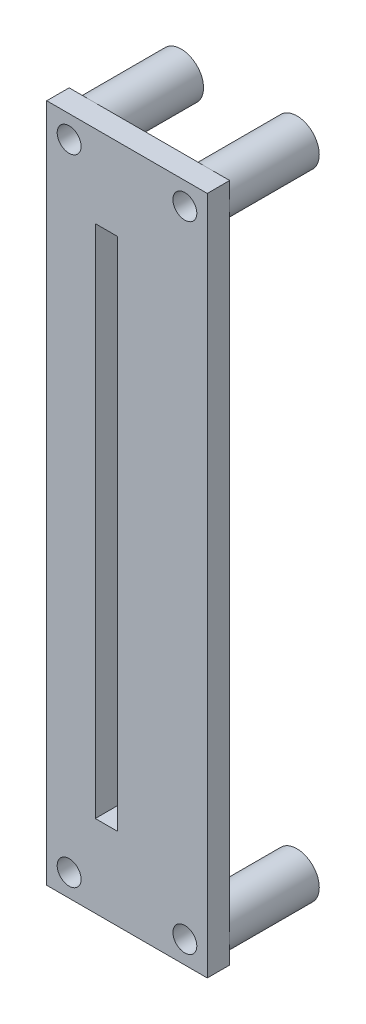
ISO-10303-21;
HEADER;
FILE_DESCRIPTION(('STEP AP214'),'2;1');
FILE_NAME('part.step','',(''),(''),'','','');
FILE_SCHEMA(('AUTOMOTIVE_DESIGN { 1 0 10303 214 1 1 1 1 }'));
ENDSEC;
DATA;
#1=APPLICATION_CONTEXT('core data for automotive mechanical design processes');
#2=APPLICATION_PROTOCOL_DEFINITION('international standard','automotive_design',2000,#1);
#3=PRODUCT_CONTEXT('',#1,'mechanical');
#4=PRODUCT('Part','Part','',(#3));
#5=PRODUCT_RELATED_PRODUCT_CATEGORY('part','',(#4));
#6=PRODUCT_DEFINITION_FORMATION('','',#4);
#7=PRODUCT_DEFINITION_CONTEXT('part definition',#1,'design');
#8=PRODUCT_DEFINITION('design','',#6,#7);
#9=PRODUCT_DEFINITION_SHAPE('','',#8);
#10=(LENGTH_UNIT() NAMED_UNIT(*) SI_UNIT(.MILLI.,.METRE.));
#11=(NAMED_UNIT(*) PLANE_ANGLE_UNIT() SI_UNIT($,.RADIAN.));
#12=(NAMED_UNIT(*) SI_UNIT($,.STERADIAN.) SOLID_ANGLE_UNIT());
#13=UNCERTAINTY_MEASURE_WITH_UNIT(LENGTH_MEASURE(1.E-05),#10,'distance_accuracy_value','');
#14=(GEOMETRIC_REPRESENTATION_CONTEXT(3) GLOBAL_UNCERTAINTY_ASSIGNED_CONTEXT((#13)) GLOBAL_UNIT_ASSIGNED_CONTEXT((#10,
#11,#12)) REPRESENTATION_CONTEXT('',''));
#15=CARTESIAN_POINT('',(0.,0.,0.));
#16=DIRECTION('',(0.,0.,1.));
#17=DIRECTION('',(1.,0.,0.));
#18=AXIS2_PLACEMENT_3D('',#15,#16,#17);
#19=CARTESIAN_POINT('',(0.,0.,0.));
#20=DIRECTION('',(0.,0.,-1.));
#21=DIRECTION('',(-1.,0.,0.));
#22=AXIS2_PLACEMENT_3D('',#19,#20,#21);
#23=PLANE('',#22);
#24=CARTESIAN_POINT('',(3.,88.,0.));
#25=DIRECTION('',(0.,0.,1.));
#26=DIRECTION('',(1.,0.,0.));
#27=AXIS2_PLACEMENT_3D('',#24,#25,#26);
#28=CIRCLE('',#27,2.99999999999997);
#29=CARTESIAN_POINT('',(3.,91.,0.));
#30=VERTEX_POINT('',#29);
#31=CARTESIAN_POINT('',(0.,88.,0.));
#32=VERTEX_POINT('',#31);
#33=EDGE_CURVE('E151',#30,#32,#28,.T.);
#34=ORIENTED_EDGE('',*,*,#33,.T.);
#35=DIRECTION('',(0.,-1.,0.));
#36=VECTOR('',#35,1.);
#37=CARTESIAN_POINT('',(0.,0.,0.));
#38=LINE('',#37,#36);
#39=CARTESIAN_POINT('',(0.,91.,0.));
#40=VERTEX_POINT('',#39);
#41=EDGE_CURVE('E133',#40,#32,#38,.T.);
#42=ORIENTED_EDGE('',*,*,#41,.F.);
#43=DIRECTION('',(-1.,0.,0.));
#44=VECTOR('',#43,1.);
#45=CARTESIAN_POINT('',(0.,91.,0.));
#46=LINE('',#45,#44);
#47=EDGE_CURVE('E152',#30,#40,#46,.T.);
#48=ORIENTED_EDGE('',*,*,#47,.F.);
#49=EDGE_LOOP('',(#34,#42,#48));
#50=FACE_BOUND('',#49,.T.);
#51=ADVANCED_FACE('F39',(#50),#23,.T.);
#52=CARTESIAN_POINT('',(18.5,88.,0.));
#53=DIRECTION('',(0.,0.,1.));
#54=DIRECTION('',(1.,0.,0.));
#55=AXIS2_PLACEMENT_3D('',#52,#53,#54);
#56=CIRCLE('',#55,2.99999999999997);
#57=CARTESIAN_POINT('',(21.5,88.,0.));
#58=VERTEX_POINT('',#57);
#59=CARTESIAN_POINT('',(18.5,91.,0.));
#60=VERTEX_POINT('',#59);
#61=EDGE_CURVE('E175',#58,#60,#56,.T.);
#62=ORIENTED_EDGE('',*,*,#61,.T.);
#63=CARTESIAN_POINT('',(21.5,91.,0.));
#64=VERTEX_POINT('',#63);
#65=EDGE_CURVE('E264',#64,#60,#46,.T.);
#66=ORIENTED_EDGE('',*,*,#65,.F.);
#67=DIRECTION('',(0.,1.,0.));
#68=VECTOR('',#67,1.);
#69=CARTESIAN_POINT('',(21.5,0.,0.));
#70=LINE('',#69,#68);
#71=EDGE_CURVE('E277',#58,#64,#70,.T.);
#72=ORIENTED_EDGE('',*,*,#71,.F.);
#73=EDGE_LOOP('',(#62,#66,#72));
#74=FACE_BOUND('',#73,.T.);
#75=ADVANCED_FACE('F328',(#74),#23,.T.);
#76=CARTESIAN_POINT('',(18.5,3.,0.));
#77=DIRECTION('',(0.,0.,1.));
#78=DIRECTION('',(1.,0.,0.));
#79=AXIS2_PLACEMENT_3D('',#76,#77,#78);
#80=CIRCLE('',#79,3.);
#81=CARTESIAN_POINT('',(18.5,0.,0.));
#82=VERTEX_POINT('',#81);
#83=CARTESIAN_POINT('',(21.5,3.,0.));
#84=VERTEX_POINT('',#83);
#85=EDGE_CURVE('E182',#82,#84,#80,.T.);
#86=ORIENTED_EDGE('',*,*,#85,.T.);
#87=CARTESIAN_POINT('',(21.5,0.,0.));
#88=VERTEX_POINT('',#87);
#89=EDGE_CURVE('E279',#88,#84,#70,.T.);
#90=ORIENTED_EDGE('',*,*,#89,.F.);
#91=DIRECTION('',(1.,0.,0.));
#92=VECTOR('',#91,1.);
#93=CARTESIAN_POINT('',(0.,0.,0.));
#94=LINE('',#93,#92);
#95=EDGE_CURVE('E142',#82,#88,#94,.T.);
#96=ORIENTED_EDGE('',*,*,#95,.F.);
#97=EDGE_LOOP('',(#86,#90,#96));
#98=FACE_BOUND('',#97,.T.);
#99=ADVANCED_FACE('F316',(#98),#23,.T.);
#100=CARTESIAN_POINT('',(0.,3.,0.));
#101=VERTEX_POINT('',#100);
#102=CARTESIAN_POINT('',(0.,0.,0.));
#103=VERTEX_POINT('',#102);
#104=EDGE_CURVE('E144',#101,#103,#38,.T.);
#105=ORIENTED_EDGE('',*,*,#104,.F.);
#106=CARTESIAN_POINT('',(3.00000000000001,3.,0.));
#107=DIRECTION('',(0.,0.,1.));
#108=DIRECTION('',(1.,0.,0.));
#109=AXIS2_PLACEMENT_3D('',#106,#107,#108);
#110=CIRCLE('',#109,3.);
#111=CARTESIAN_POINT('',(3.00000000000001,0.,0.));
#112=VERTEX_POINT('',#111);
#113=EDGE_CURVE('E50',#101,#112,#110,.T.);
#114=ORIENTED_EDGE('',*,*,#113,.T.);
#115=EDGE_CURVE('E273',#103,#112,#94,.T.);
#116=ORIENTED_EDGE('',*,*,#115,.F.);
#117=EDGE_LOOP('',(#105,#114,#116));
#118=FACE_BOUND('',#117,.T.);
#119=ADVANCED_FACE('F307',(#118),#23,.T.);
#120=CARTESIAN_POINT('',(0.,0.,3.));
#121=DIRECTION('',(0.,0.,-1.));
#122=DIRECTION('',(-1.,0.,0.));
#123=AXIS2_PLACEMENT_3D('',#120,#121,#122);
#124=PLANE('',#123);
#125=CARTESIAN_POINT('',(18.5,3.,3.));
#126=DIRECTION('',(0.,0.,1.));
#127=DIRECTION('',(1.,0.,0.));
#128=AXIS2_PLACEMENT_3D('',#125,#126,#127);
#129=CIRCLE('',#128,1.6);
#130=CARTESIAN_POINT('',(20.1,3.,3.));
#131=VERTEX_POINT('',#130);
#132=EDGE_CURVE('E243',#131,#131,#129,.T.);
#133=ORIENTED_EDGE('',*,*,#132,.F.);
#134=EDGE_LOOP('',(#133));
#135=FACE_BOUND('',#134,.T.);
#136=CARTESIAN_POINT('',(3.00000000000001,3.,3.));
#137=DIRECTION('',(0.,0.,1.));
#138=DIRECTION('',(1.,0.,0.));
#139=AXIS2_PLACEMENT_3D('',#136,#137,#138);
#140=CIRCLE('',#139,1.6);
#141=CARTESIAN_POINT('',(4.60000000000001,3.,3.));
#142=VERTEX_POINT('',#141);
#143=EDGE_CURVE('E247',#142,#142,#140,.T.);
#144=ORIENTED_EDGE('',*,*,#143,.F.);
#145=EDGE_LOOP('',(#144));
#146=FACE_BOUND('',#145,.T.);
#147=CARTESIAN_POINT('',(18.5,88.,3.));
#148=DIRECTION('',(0.,0.,1.));
#149=DIRECTION('',(1.,0.,0.));
#150=AXIS2_PLACEMENT_3D('',#147,#148,#149);
#151=CIRCLE('',#150,1.60000000000001);
#152=CARTESIAN_POINT('',(20.1,88.,3.));
#153=VERTEX_POINT('',#152);
#154=EDGE_CURVE('E251',#153,#153,#151,.T.);
#155=ORIENTED_EDGE('',*,*,#154,.F.);
#156=EDGE_LOOP('',(#155));
#157=FACE_BOUND('',#156,.T.);
#158=CARTESIAN_POINT('',(3.,88.,3.));
#159=DIRECTION('',(0.,0.,1.));
#160=DIRECTION('',(1.,0.,0.));
#161=AXIS2_PLACEMENT_3D('',#158,#159,#160);
#162=CIRCLE('',#161,1.6);
#163=CARTESIAN_POINT('',(4.6,88.,3.));
#164=VERTEX_POINT('',#163);
#165=EDGE_CURVE('E255',#164,#164,#162,.T.);
#166=ORIENTED_EDGE('',*,*,#165,.F.);
#167=EDGE_LOOP('',(#166));
#168=FACE_BOUND('',#167,.T.);
#169=DIRECTION('',(0.,-1.,0.));
#170=VECTOR('',#169,1.);
#171=CARTESIAN_POINT('',(0.,0.,3.));
#172=LINE('',#171,#170);
#173=CARTESIAN_POINT('',(0.,91.,3.));
#174=VERTEX_POINT('',#173);
#175=CARTESIAN_POINT('',(0.,0.,3.));
#176=VERTEX_POINT('',#175);
#177=EDGE_CURVE('E259',#174,#176,#172,.T.);
#178=ORIENTED_EDGE('',*,*,#177,.T.);
#179=DIRECTION('',(1.,0.,0.));
#180=VECTOR('',#179,1.);
#181=CARTESIAN_POINT('',(0.,0.,3.));
#182=LINE('',#181,#180);
#183=CARTESIAN_POINT('',(21.5,0.,3.));
#184=VERTEX_POINT('',#183);
#185=EDGE_CURVE('E263',#176,#184,#182,.T.);
#186=ORIENTED_EDGE('',*,*,#185,.T.);
#187=DIRECTION('',(0.,1.,0.));
#188=VECTOR('',#187,1.);
#189=CARTESIAN_POINT('',(21.5,0.,3.));
#190=LINE('',#189,#188);
#191=CARTESIAN_POINT('',(21.5,91.,3.));
#192=VERTEX_POINT('',#191);
#193=EDGE_CURVE('E267',#184,#192,#190,.T.);
#194=ORIENTED_EDGE('',*,*,#193,.T.);
#195=DIRECTION('',(-1.,0.,0.));
#196=VECTOR('',#195,1.);
#197=CARTESIAN_POINT('',(0.,91.,3.));
#198=LINE('',#197,#196);
#199=EDGE_CURVE('E270',#192,#174,#198,.T.);
#200=ORIENTED_EDGE('',*,*,#199,.T.);
#201=EDGE_LOOP('',(#178,#186,#194,#200));
#202=FACE_BOUND('',#201,.T.);
#203=DIRECTION('',(0.,-1.,0.));
#204=VECTOR('',#203,1.);
#205=CARTESIAN_POINT('',(6.50000000000001,80.,3.));
#206=LINE('',#205,#204);
#207=CARTESIAN_POINT('',(6.50000000000001,80.,3.));
#208=VERTEX_POINT('',#207);
#209=CARTESIAN_POINT('',(6.50000000000002,11.,3.));
#210=VERTEX_POINT('',#209);
#211=EDGE_CURVE('E201',#208,#210,#206,.T.);
#212=ORIENTED_EDGE('',*,*,#211,.F.);
#213=DIRECTION('',(-1.,0.,0.));
#214=VECTOR('',#213,1.);
#215=CARTESIAN_POINT('',(6.50000000000001,80.,3.));
#216=LINE('',#215,#214);
#217=CARTESIAN_POINT('',(9.50000000000001,80.,3.));
#218=VERTEX_POINT('',#217);
#219=EDGE_CURVE('E212',#218,#208,#216,.T.);
#220=ORIENTED_EDGE('',*,*,#219,.F.);
#221=DIRECTION('',(0.,1.,0.));
#222=VECTOR('',#221,1.);
#223=CARTESIAN_POINT('',(9.50000000000001,80.,3.));
#224=LINE('',#223,#222);
#225=CARTESIAN_POINT('',(9.50000000000002,11.,3.));
#226=VERTEX_POINT('',#225);
#227=EDGE_CURVE('E208',#226,#218,#224,.T.);
#228=ORIENTED_EDGE('',*,*,#227,.F.);
#229=DIRECTION('',(1.,0.,0.));
#230=VECTOR('',#229,1.);
#231=CARTESIAN_POINT('',(6.50000000000002,11.,3.));
#232=LINE('',#231,#230);
#233=EDGE_CURVE('E204',#210,#226,#232,.T.);
#234=ORIENTED_EDGE('',*,*,#233,.F.);
#235=EDGE_LOOP('',(#212,#220,#228,#234));
#236=FACE_BOUND('',#235,.T.);
#237=ADVANCED_FACE('F354',(#135,#146,#157,#168,#202,#236),#124,.F.);
#238=EDGE_CURVE('E57',#32,#30,#28,.T.);
#239=ORIENTED_EDGE('',*,*,#238,.T.);
#240=EDGE_CURVE('E285',#60,#30,#46,.T.);
#241=ORIENTED_EDGE('',*,*,#240,.F.);
#242=EDGE_CURVE('E63',#60,#58,#56,.T.);
#243=ORIENTED_EDGE('',*,*,#242,.T.);
#244=EDGE_CURVE('E282',#84,#58,#70,.T.);
#245=ORIENTED_EDGE('',*,*,#244,.F.);
#246=EDGE_CURVE('E188',#84,#82,#80,.T.);
#247=ORIENTED_EDGE('',*,*,#246,.T.);
#248=EDGE_CURVE('E278',#112,#82,#94,.T.);
#249=ORIENTED_EDGE('',*,*,#248,.F.);
#250=EDGE_CURVE('E11',#112,#101,#110,.T.);
#251=ORIENTED_EDGE('',*,*,#250,.T.);
#252=EDGE_CURVE('E134',#32,#101,#38,.T.);
#253=ORIENTED_EDGE('',*,*,#252,.F.);
#254=EDGE_LOOP('',(#239,#241,#243,#245,#247,#249,#251,#253));
#255=FACE_BOUND('',#254,.T.);
#256=DIRECTION('',(-1.,0.,0.));
#257=VECTOR('',#256,1.);
#258=CARTESIAN_POINT('',(6.50000000000001,80.,0.));
#259=LINE('',#258,#257);
#260=CARTESIAN_POINT('',(9.50000000000001,80.,0.));
#261=VERTEX_POINT('',#260);
#262=CARTESIAN_POINT('',(6.50000000000001,80.,0.));
#263=VERTEX_POINT('',#262);
#264=EDGE_CURVE('E205',#261,#263,#259,.T.);
#265=ORIENTED_EDGE('',*,*,#264,.T.);
#266=DIRECTION('',(0.,-1.,0.));
#267=VECTOR('',#266,1.);
#268=CARTESIAN_POINT('',(6.50000000000001,80.,0.));
#269=LINE('',#268,#267);
#270=CARTESIAN_POINT('',(6.50000000000002,11.,0.));
#271=VERTEX_POINT('',#270);
#272=EDGE_CURVE('E197',#263,#271,#269,.T.);
#273=ORIENTED_EDGE('',*,*,#272,.T.);
#274=DIRECTION('',(1.,0.,0.));
#275=VECTOR('',#274,1.);
#276=CARTESIAN_POINT('',(6.50000000000002,11.,0.));
#277=LINE('',#276,#275);
#278=CARTESIAN_POINT('',(9.50000000000002,11.,0.));
#279=VERTEX_POINT('',#278);
#280=EDGE_CURVE('E219',#271,#279,#277,.T.);
#281=ORIENTED_EDGE('',*,*,#280,.T.);
#282=DIRECTION('',(0.,1.,0.));
#283=VECTOR('',#282,1.);
#284=CARTESIAN_POINT('',(9.50000000000001,80.,0.));
#285=LINE('',#284,#283);
#286=EDGE_CURVE('E223',#279,#261,#285,.T.);
#287=ORIENTED_EDGE('',*,*,#286,.T.);
#288=EDGE_LOOP('',(#265,#273,#281,#287));
#289=FACE_BOUND('',#288,.T.);
#290=ADVANCED_FACE('F145',(#255,#289),#23,.T.);
#291=CARTESIAN_POINT('',(0.,0.,3.));
#292=DIRECTION('',(1.,0.,0.));
#293=DIRECTION('',(0.,1.,0.));
#294=AXIS2_PLACEMENT_3D('',#291,#292,#293);
#295=PLANE('',#294);
#296=ORIENTED_EDGE('',*,*,#41,.T.);
#297=ORIENTED_EDGE('',*,*,#252,.T.);
#298=ORIENTED_EDGE('',*,*,#104,.T.);
#299=DIRECTION('',(0.,0.,-1.));
#300=VECTOR('',#299,1.);
#301=CARTESIAN_POINT('',(0.,0.,3.));
#302=LINE('',#301,#300);
#303=EDGE_CURVE('E43',#176,#103,#302,.T.);
#304=ORIENTED_EDGE('',*,*,#303,.F.);
#305=ORIENTED_EDGE('',*,*,#177,.F.);
#306=DIRECTION('',(0.,0.,-1.));
#307=VECTOR('',#306,1.);
#308=CARTESIAN_POINT('',(0.,91.,3.));
#309=LINE('',#308,#307);
#310=EDGE_CURVE('E138',#174,#40,#309,.T.);
#311=ORIENTED_EDGE('',*,*,#310,.T.);
#312=EDGE_LOOP('',(#296,#297,#298,#304,#305,#311));
#313=FACE_BOUND('',#312,.T.);
#314=ADVANCED_FACE('F41',(#313),#295,.F.);
#315=CARTESIAN_POINT('',(0.,0.,3.));
#316=DIRECTION('',(0.,1.,0.));
#317=DIRECTION('',(-1.,0.,0.));
#318=AXIS2_PLACEMENT_3D('',#315,#316,#317);
#319=PLANE('',#318);
#320=ORIENTED_EDGE('',*,*,#115,.T.);
#321=ORIENTED_EDGE('',*,*,#248,.T.);
#322=ORIENTED_EDGE('',*,*,#95,.T.);
#323=DIRECTION('',(0.,0.,-1.));
#324=VECTOR('',#323,1.);
#325=CARTESIAN_POINT('',(21.5,0.,3.));
#326=LINE('',#325,#324);
#327=EDGE_CURVE('E291',#184,#88,#326,.T.);
#328=ORIENTED_EDGE('',*,*,#327,.F.);
#329=ORIENTED_EDGE('',*,*,#185,.F.);
#330=ORIENTED_EDGE('',*,*,#303,.T.);
#331=EDGE_LOOP('',(#320,#321,#322,#328,#329,#330));
#332=FACE_BOUND('',#331,.T.);
#333=ADVANCED_FACE('F302',(#332),#319,.F.);
#334=CARTESIAN_POINT('',(21.5,0.,3.));
#335=DIRECTION('',(-1.,0.,0.));
#336=DIRECTION('',(0.,-1.,0.));
#337=AXIS2_PLACEMENT_3D('',#334,#335,#336);
#338=PLANE('',#337);
#339=ORIENTED_EDGE('',*,*,#89,.T.);
#340=ORIENTED_EDGE('',*,*,#244,.T.);
#341=ORIENTED_EDGE('',*,*,#71,.T.);
#342=DIRECTION('',(0.,0.,-1.));
#343=VECTOR('',#342,1.);
#344=CARTESIAN_POINT('',(21.5,91.,3.));
#345=LINE('',#344,#343);
#346=EDGE_CURVE('E288',#192,#64,#345,.T.);
#347=ORIENTED_EDGE('',*,*,#346,.F.);
#348=ORIENTED_EDGE('',*,*,#193,.F.);
#349=ORIENTED_EDGE('',*,*,#327,.T.);
#350=EDGE_LOOP('',(#339,#340,#341,#347,#348,#349));
#351=FACE_BOUND('',#350,.T.);
#352=ADVANCED_FACE('F318',(#351),#338,.F.);
#353=CARTESIAN_POINT('',(0.,91.,3.));
#354=DIRECTION('',(0.,-1.,0.));
#355=DIRECTION('',(0.,0.,-1.));
#356=AXIS2_PLACEMENT_3D('',#353,#354,#355);
#357=PLANE('',#356);
#358=ORIENTED_EDGE('',*,*,#65,.T.);
#359=ORIENTED_EDGE('',*,*,#240,.T.);
#360=ORIENTED_EDGE('',*,*,#47,.T.);
#361=ORIENTED_EDGE('',*,*,#310,.F.);
#362=ORIENTED_EDGE('',*,*,#199,.F.);
#363=ORIENTED_EDGE('',*,*,#346,.T.);
#364=EDGE_LOOP('',(#358,#359,#360,#361,#362,#363));
#365=FACE_BOUND('',#364,.T.);
#366=ADVANCED_FACE('F327',(#365),#357,.F.);
#367=CARTESIAN_POINT('',(3.,88.,3.));
#368=DIRECTION('',(0.,0.,-1.));
#369=DIRECTION('',(-1.,0.,0.));
#370=AXIS2_PLACEMENT_3D('',#367,#368,#369);
#371=CYLINDRICAL_SURFACE('',#370,1.6);
#372=ORIENTED_EDGE('',*,*,#165,.T.);
#373=EDGE_LOOP('',(#372));
#374=FACE_BOUND('',#373,.T.);
#375=CARTESIAN_POINT('',(3.,88.,-12.));
#376=DIRECTION('',(0.,0.,1.));
#377=DIRECTION('',(1.,0.,0.));
#378=AXIS2_PLACEMENT_3D('',#375,#376,#377);
#379=CIRCLE('',#378,1.60000000000001);
#380=CARTESIAN_POINT('',(4.60000000000001,88.,-12.));
#381=VERTEX_POINT('',#380);
#382=EDGE_CURVE('E160',#381,#381,#379,.T.);
#383=ORIENTED_EDGE('',*,*,#382,.F.);
#384=EDGE_LOOP('',(#383));
#385=FACE_BOUND('',#384,.T.);
#386=ADVANCED_FACE('F459',(#374,#385),#371,.F.);
#387=CARTESIAN_POINT('',(18.5,88.,3.));
#388=DIRECTION('',(0.,0.,-1.));
#389=DIRECTION('',(-1.,0.,0.));
#390=AXIS2_PLACEMENT_3D('',#387,#388,#389);
#391=CYLINDRICAL_SURFACE('',#390,1.60000000000001);
#392=ORIENTED_EDGE('',*,*,#154,.T.);
#393=EDGE_LOOP('',(#392));
#394=FACE_BOUND('',#393,.T.);
#395=CARTESIAN_POINT('',(18.5,88.,-12.));
#396=DIRECTION('',(0.,0.,1.));
#397=DIRECTION('',(1.,0.,0.));
#398=AXIS2_PLACEMENT_3D('',#395,#396,#397);
#399=CIRCLE('',#398,1.60000000000001);
#400=CARTESIAN_POINT('',(20.1,88.,-12.));
#401=VERTEX_POINT('',#400);
#402=EDGE_CURVE('E166',#401,#401,#399,.T.);
#403=ORIENTED_EDGE('',*,*,#402,.F.);
#404=EDGE_LOOP('',(#403));
#405=FACE_BOUND('',#404,.T.);
#406=ADVANCED_FACE('F466',(#394,#405),#391,.F.);
#407=CARTESIAN_POINT('',(3.00000000000001,3.,3.));
#408=DIRECTION('',(0.,0.,-1.));
#409=DIRECTION('',(-1.,0.,0.));
#410=AXIS2_PLACEMENT_3D('',#407,#408,#409);
#411=CYLINDRICAL_SURFACE('',#410,1.6);
#412=ORIENTED_EDGE('',*,*,#143,.T.);
#413=EDGE_LOOP('',(#412));
#414=FACE_BOUND('',#413,.T.);
#415=CARTESIAN_POINT('',(3.00000000000001,3.,-12.));
#416=DIRECTION('',(0.,0.,1.));
#417=DIRECTION('',(1.,0.,0.));
#418=AXIS2_PLACEMENT_3D('',#415,#416,#417);
#419=CIRCLE('',#418,1.6);
#420=CARTESIAN_POINT('',(4.60000000000001,3.,-12.));
#421=VERTEX_POINT('',#420);
#422=EDGE_CURVE('E187',#421,#421,#419,.T.);
#423=ORIENTED_EDGE('',*,*,#422,.F.);
#424=EDGE_LOOP('',(#423));
#425=FACE_BOUND('',#424,.T.);
#426=ADVANCED_FACE('F476',(#414,#425),#411,.F.);
#427=CARTESIAN_POINT('',(18.5,3.,3.));
#428=DIRECTION('',(0.,0.,-1.));
#429=DIRECTION('',(-1.,0.,0.));
#430=AXIS2_PLACEMENT_3D('',#427,#428,#429);
#431=CYLINDRICAL_SURFACE('',#430,1.6);
#432=ORIENTED_EDGE('',*,*,#132,.T.);
#433=EDGE_LOOP('',(#432));
#434=FACE_BOUND('',#433,.T.);
#435=CARTESIAN_POINT('',(18.5,3.,-12.));
#436=DIRECTION('',(0.,0.,1.));
#437=DIRECTION('',(1.,0.,0.));
#438=AXIS2_PLACEMENT_3D('',#435,#436,#437);
#439=CIRCLE('',#438,1.6);
#440=CARTESIAN_POINT('',(20.1,3.,-12.));
#441=VERTEX_POINT('',#440);
#442=EDGE_CURVE('E174',#441,#441,#439,.T.);
#443=ORIENTED_EDGE('',*,*,#442,.F.);
#444=EDGE_LOOP('',(#443));
#445=FACE_BOUND('',#444,.T.);
#446=ADVANCED_FACE('F418',(#434,#445),#431,.F.);
#447=CARTESIAN_POINT('',(6.50000000000001,80.,3.));
#448=DIRECTION('',(1.,0.,0.));
#449=DIRECTION('',(0.,1.,0.));
#450=AXIS2_PLACEMENT_3D('',#447,#448,#449);
#451=PLANE('',#450);
#452=ORIENTED_EDGE('',*,*,#272,.F.);
#453=DIRECTION('',(0.,0.,-1.));
#454=VECTOR('',#453,1.);
#455=CARTESIAN_POINT('',(6.50000000000001,80.,3.));
#456=LINE('',#455,#454);
#457=EDGE_CURVE('E215',#208,#263,#456,.T.);
#458=ORIENTED_EDGE('',*,*,#457,.F.);
#459=ORIENTED_EDGE('',*,*,#211,.T.);
#460=DIRECTION('',(0.,0.,-1.));
#461=VECTOR('',#460,1.);
#462=CARTESIAN_POINT('',(6.50000000000002,11.,3.));
#463=LINE('',#462,#461);
#464=EDGE_CURVE('E239',#210,#271,#463,.T.);
#465=ORIENTED_EDGE('',*,*,#464,.T.);
#466=EDGE_LOOP('',(#452,#458,#459,#465));
#467=FACE_BOUND('',#466,.T.);
#468=ADVANCED_FACE('F408',(#467),#451,.T.);
#469=CARTESIAN_POINT('',(6.50000000000002,11.,3.));
#470=DIRECTION('',(0.,1.,0.));
#471=DIRECTION('',(0.,0.,1.));
#472=AXIS2_PLACEMENT_3D('',#469,#470,#471);
#473=PLANE('',#472);
#474=ORIENTED_EDGE('',*,*,#280,.F.);
#475=ORIENTED_EDGE('',*,*,#464,.F.);
#476=ORIENTED_EDGE('',*,*,#233,.T.);
#477=DIRECTION('',(0.,0.,-1.));
#478=VECTOR('',#477,1.);
#479=CARTESIAN_POINT('',(9.50000000000002,11.,3.));
#480=LINE('',#479,#478);
#481=EDGE_CURVE('E236',#226,#279,#480,.T.);
#482=ORIENTED_EDGE('',*,*,#481,.T.);
#483=EDGE_LOOP('',(#474,#475,#476,#482));
#484=FACE_BOUND('',#483,.T.);
#485=ADVANCED_FACE('F398',(#484),#473,.T.);
#486=CARTESIAN_POINT('',(9.50000000000001,80.,3.));
#487=DIRECTION('',(-1.,0.,0.));
#488=DIRECTION('',(0.,-1.,0.));
#489=AXIS2_PLACEMENT_3D('',#486,#487,#488);
#490=PLANE('',#489);
#491=ORIENTED_EDGE('',*,*,#286,.F.);
#492=ORIENTED_EDGE('',*,*,#481,.F.);
#493=ORIENTED_EDGE('',*,*,#227,.T.);
#494=DIRECTION('',(0.,0.,-1.));
#495=VECTOR('',#494,1.);
#496=CARTESIAN_POINT('',(9.50000000000001,80.,3.));
#497=LINE('',#496,#495);
#498=EDGE_CURVE('E233',#218,#261,#497,.T.);
#499=ORIENTED_EDGE('',*,*,#498,.T.);
#500=EDGE_LOOP('',(#491,#492,#493,#499));
#501=FACE_BOUND('',#500,.T.);
#502=ADVANCED_FACE('F386',(#501),#490,.T.);
#503=CARTESIAN_POINT('',(6.50000000000001,80.,3.));
#504=DIRECTION('',(0.,-1.,0.));
#505=DIRECTION('',(0.,0.,-1.));
#506=AXIS2_PLACEMENT_3D('',#503,#504,#505);
#507=PLANE('',#506);
#508=ORIENTED_EDGE('',*,*,#264,.F.);
#509=ORIENTED_EDGE('',*,*,#498,.F.);
#510=ORIENTED_EDGE('',*,*,#219,.T.);
#511=ORIENTED_EDGE('',*,*,#457,.T.);
#512=EDGE_LOOP('',(#508,#509,#510,#511));
#513=FACE_BOUND('',#512,.T.);
#514=ADVANCED_FACE('F380',(#513),#507,.T.);
#515=CARTESIAN_POINT('',(3.00000000000001,3.,-12.));
#516=DIRECTION('',(0.,0.,1.));
#517=DIRECTION('',(1.,0.,0.));
#518=AXIS2_PLACEMENT_3D('',#515,#516,#517);
#519=CYLINDRICAL_SURFACE('',#518,3.);
#520=CARTESIAN_POINT('',(3.00000000000001,3.,-12.));
#521=DIRECTION('',(0.,0.,1.));
#522=DIRECTION('',(1.,0.,0.));
#523=AXIS2_PLACEMENT_3D('',#520,#521,#522);
#524=CIRCLE('',#523,3.);
#525=CARTESIAN_POINT('',(6.00000000000001,3.,-12.));
#526=VERTEX_POINT('',#525);
#527=EDGE_CURVE('E194',#526,#526,#524,.T.);
#528=ORIENTED_EDGE('',*,*,#527,.T.);
#529=EDGE_LOOP('',(#528));
#530=FACE_BOUND('',#529,.T.);
#531=ORIENTED_EDGE('',*,*,#113,.F.);
#532=ORIENTED_EDGE('',*,*,#250,.F.);
#533=EDGE_LOOP('',(#531,#532));
#534=FACE_BOUND('',#533,.T.);
#535=ADVANCED_FACE('F385',(#530,#534),#519,.T.);
#536=CARTESIAN_POINT('',(3.00000000000001,3.,-12.));
#537=DIRECTION('',(0.,0.,1.));
#538=DIRECTION('',(1.,0.,0.));
#539=AXIS2_PLACEMENT_3D('',#536,#537,#538);
#540=PLANE('',#539);
#541=ORIENTED_EDGE('',*,*,#422,.T.);
#542=EDGE_LOOP('',(#541));
#543=FACE_BOUND('',#542,.T.);
#544=ORIENTED_EDGE('',*,*,#527,.F.);
#545=EDGE_LOOP('',(#544));
#546=FACE_BOUND('',#545,.T.);
#547=ADVANCED_FACE('F505',(#543,#546),#540,.F.);
#548=CARTESIAN_POINT('',(18.5,3.,-12.));
#549=DIRECTION('',(0.,0.,1.));
#550=DIRECTION('',(1.,0.,0.));
#551=AXIS2_PLACEMENT_3D('',#548,#549,#550);
#552=CYLINDRICAL_SURFACE('',#551,3.);
#553=CARTESIAN_POINT('',(18.5,3.,-12.));
#554=DIRECTION('',(0.,0.,1.));
#555=DIRECTION('',(1.,0.,0.));
#556=AXIS2_PLACEMENT_3D('',#553,#554,#555);
#557=CIRCLE('',#556,3.);
#558=CARTESIAN_POINT('',(21.5,3.,-12.));
#559=VERTEX_POINT('',#558);
#560=EDGE_CURVE('E183',#559,#559,#557,.T.);
#561=ORIENTED_EDGE('',*,*,#560,.T.);
#562=EDGE_LOOP('',(#561));
#563=FACE_BOUND('',#562,.T.);
#564=ORIENTED_EDGE('',*,*,#246,.F.);
#565=ORIENTED_EDGE('',*,*,#85,.F.);
#566=EDGE_LOOP('',(#564,#565));
#567=FACE_BOUND('',#566,.T.);
#568=ADVANCED_FACE('F514',(#563,#567),#552,.T.);
#569=CARTESIAN_POINT('',(18.5,3.,-12.));
#570=DIRECTION('',(0.,0.,1.));
#571=DIRECTION('',(1.,0.,0.));
#572=AXIS2_PLACEMENT_3D('',#569,#570,#571);
#573=PLANE('',#572);
#574=ORIENTED_EDGE('',*,*,#442,.T.);
#575=EDGE_LOOP('',(#574));
#576=FACE_BOUND('',#575,.T.);
#577=ORIENTED_EDGE('',*,*,#560,.F.);
#578=EDGE_LOOP('',(#577));
#579=FACE_BOUND('',#578,.T.);
#580=ADVANCED_FACE('F523',(#576,#579),#573,.F.);
#581=CARTESIAN_POINT('',(18.5,88.,-12.));
#582=DIRECTION('',(0.,0.,1.));
#583=DIRECTION('',(1.,0.,0.));
#584=AXIS2_PLACEMENT_3D('',#581,#582,#583);
#585=CYLINDRICAL_SURFACE('',#584,2.99999999999997);
#586=CARTESIAN_POINT('',(18.5,88.,-12.));
#587=DIRECTION('',(0.,0.,1.));
#588=DIRECTION('',(1.,0.,0.));
#589=AXIS2_PLACEMENT_3D('',#586,#587,#588);
#590=CIRCLE('',#589,2.99999999999997);
#591=CARTESIAN_POINT('',(21.5,88.,-12.));
#592=VERTEX_POINT('',#591);
#593=EDGE_CURVE('E170',#592,#592,#590,.T.);
#594=ORIENTED_EDGE('',*,*,#593,.T.);
#595=EDGE_LOOP('',(#594));
#596=FACE_BOUND('',#595,.T.);
#597=ORIENTED_EDGE('',*,*,#61,.F.);
#598=ORIENTED_EDGE('',*,*,#242,.F.);
#599=EDGE_LOOP('',(#597,#598));
#600=FACE_BOUND('',#599,.T.);
#601=ADVANCED_FACE('F330',(#596,#600),#585,.T.);
#602=CARTESIAN_POINT('',(18.5,88.,-12.));
#603=DIRECTION('',(0.,0.,1.));
#604=DIRECTION('',(1.,0.,0.));
#605=AXIS2_PLACEMENT_3D('',#602,#603,#604);
#606=PLANE('',#605);
#607=ORIENTED_EDGE('',*,*,#402,.T.);
#608=EDGE_LOOP('',(#607));
#609=FACE_BOUND('',#608,.T.);
#610=ORIENTED_EDGE('',*,*,#593,.F.);
#611=EDGE_LOOP('',(#610));
#612=FACE_BOUND('',#611,.T.);
#613=ADVANCED_FACE('F344',(#609,#612),#606,.F.);
#614=CARTESIAN_POINT('',(3.,88.,-12.));
#615=DIRECTION('',(0.,0.,1.));
#616=DIRECTION('',(1.,0.,0.));
#617=AXIS2_PLACEMENT_3D('',#614,#615,#616);
#618=CYLINDRICAL_SURFACE('',#617,2.99999999999997);
#619=CARTESIAN_POINT('',(3.,88.,-12.));
#620=DIRECTION('',(0.,0.,1.));
#621=DIRECTION('',(1.,0.,0.));
#622=AXIS2_PLACEMENT_3D('',#619,#620,#621);
#623=CIRCLE('',#622,2.99999999999997);
#624=CARTESIAN_POINT('',(5.99999999999997,88.,-12.));
#625=VERTEX_POINT('',#624);
#626=EDGE_CURVE('E156',#625,#625,#623,.T.);
#627=ORIENTED_EDGE('',*,*,#626,.T.);
#628=EDGE_LOOP('',(#627));
#629=FACE_BOUND('',#628,.T.);
#630=ORIENTED_EDGE('',*,*,#33,.F.);
#631=ORIENTED_EDGE('',*,*,#238,.F.);
#632=EDGE_LOOP('',(#630,#631));
#633=FACE_BOUND('',#632,.T.);
#634=ADVANCED_FACE('F158',(#629,#633),#618,.T.);
#635=CARTESIAN_POINT('',(3.,88.,-12.));
#636=DIRECTION('',(0.,0.,1.));
#637=DIRECTION('',(1.,0.,0.));
#638=AXIS2_PLACEMENT_3D('',#635,#636,#637);
#639=PLANE('',#638);
#640=ORIENTED_EDGE('',*,*,#382,.T.);
#641=EDGE_LOOP('',(#640));
#642=FACE_BOUND('',#641,.T.);
#643=ORIENTED_EDGE('',*,*,#626,.F.);
#644=EDGE_LOOP('',(#643));
#645=FACE_BOUND('',#644,.T.);
#646=ADVANCED_FACE('F337',(#642,#645),#639,.F.);
#647=CLOSED_SHELL('',(#51,#75,#99,#119,#237,#290,#314,#333,#352,#366,#386,#406,#426,#446,#468,
#485,#502,#514,#535,#547,#568,#580,#601,#613,#634,#646));
#648=MANIFOLD_SOLID_BREP('B2',#647);
#649=ADVANCED_BREP_SHAPE_REPRESENTATION('',(#18,#648),#14);
#650=SHAPE_DEFINITION_REPRESENTATION(#9,#649);
ENDSEC;
END-ISO-10303-21;
